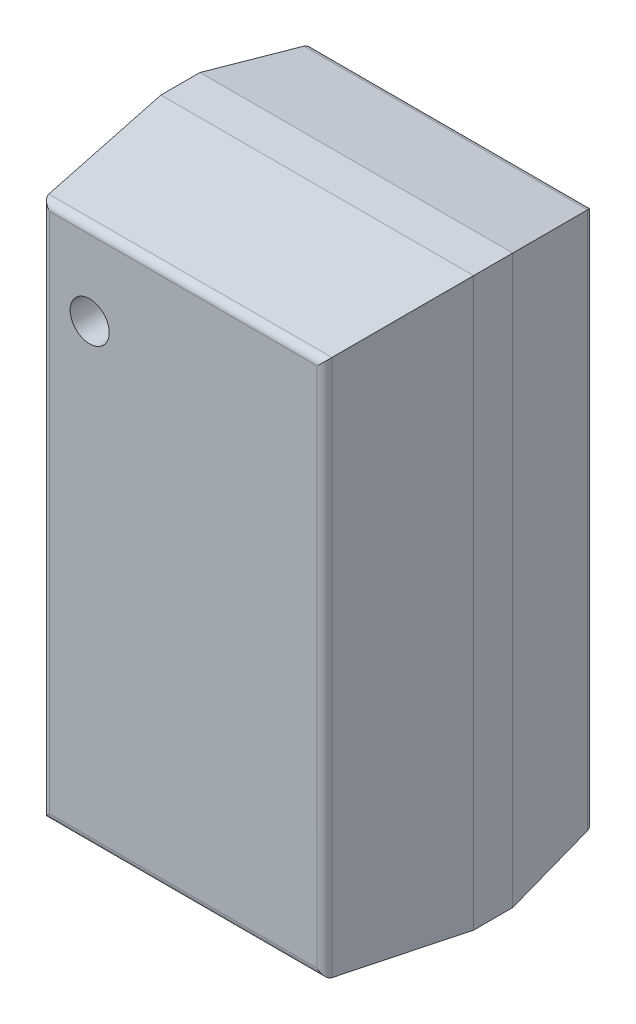
ISO-10303-21;
HEADER;
FILE_DESCRIPTION(('STEP AP214'),'2;1');
FILE_NAME('part.step','',(''),(''),'','','');
FILE_SCHEMA(('AUTOMOTIVE_DESIGN { 1 0 10303 214 1 1 1 1 }'));
ENDSEC;
DATA;
#1=APPLICATION_CONTEXT('core data for automotive mechanical design processes');
#2=APPLICATION_PROTOCOL_DEFINITION('international standard','automotive_design',2000,#1);
#3=PRODUCT_CONTEXT('',#1,'mechanical');
#4=PRODUCT('Part','Part','',(#3));
#5=PRODUCT_RELATED_PRODUCT_CATEGORY('part','',(#4));
#6=PRODUCT_DEFINITION_FORMATION('','',#4);
#7=PRODUCT_DEFINITION_CONTEXT('part definition',#1,'design');
#8=PRODUCT_DEFINITION('design','',#6,#7);
#9=PRODUCT_DEFINITION_SHAPE('','',#8);
#10=(LENGTH_UNIT() NAMED_UNIT(*) SI_UNIT(.MILLI.,.METRE.));
#11=(NAMED_UNIT(*) PLANE_ANGLE_UNIT() SI_UNIT($,.RADIAN.));
#12=(NAMED_UNIT(*) SI_UNIT($,.STERADIAN.) SOLID_ANGLE_UNIT());
#13=UNCERTAINTY_MEASURE_WITH_UNIT(LENGTH_MEASURE(1.E-05),#10,'distance_accuracy_value','');
#14=(GEOMETRIC_REPRESENTATION_CONTEXT(3) GLOBAL_UNCERTAINTY_ASSIGNED_CONTEXT((#13)) GLOBAL_UNIT_ASSIGNED_CONTEXT((#10,
#11,#12)) REPRESENTATION_CONTEXT('',''));
#15=CARTESIAN_POINT('',(0.,0.,0.));
#16=DIRECTION('',(0.,0.,1.));
#17=DIRECTION('',(1.,0.,0.));
#18=AXIS2_PLACEMENT_3D('',#15,#16,#17);
#19=CARTESIAN_POINT('',(-0.48,0.95,1.305));
#20=DIRECTION('',(0.,0.,1.));
#21=DIRECTION('',(1.,0.,0.));
#22=AXIS2_PLACEMENT_3D('',#19,#20,#21);
#23=PLANE('',#22);
#24=CARTESIAN_POINT('',(-0.48,0.95,1.305));
#25=DIRECTION('',(0.,0.,1.));
#26=DIRECTION('',(1.,0.,0.));
#27=AXIS2_PLACEMENT_3D('',#24,#25,#26);
#28=CIRCLE('',#27,0.1);
#29=CARTESIAN_POINT('',(-0.38,0.95,1.305));
#30=VERTEX_POINT('',#29);
#31=EDGE_CURVE('E20',#30,#30,#28,.T.);
#32=ORIENTED_EDGE('',*,*,#31,.T.);
#33=EDGE_LOOP('',(#32));
#34=FACE_BOUND('',#33,.T.);
#35=ADVANCED_FACE('F17',(#34),#23,.T.);
#36=CARTESIAN_POINT('',(-0.48,0.95,1.305));
#37=DIRECTION('',(0.,0.,1.));
#38=DIRECTION('',(1.,0.,0.));
#39=AXIS2_PLACEMENT_3D('',#36,#37,#38);
#40=CYLINDRICAL_SURFACE('',#39,0.1);
#41=CARTESIAN_POINT('',(-0.48,0.95,1.45));
#42=DIRECTION('',(0.,0.,1.));
#43=DIRECTION('',(1.,0.,0.));
#44=AXIS2_PLACEMENT_3D('',#41,#42,#43);
#45=CIRCLE('',#44,0.1);
#46=CARTESIAN_POINT('',(-0.38,0.95,1.45));
#47=VERTEX_POINT('',#46);
#48=EDGE_CURVE('E100',#47,#47,#45,.F.);
#49=ORIENTED_EDGE('',*,*,#48,.F.);
#50=EDGE_LOOP('',(#49));
#51=FACE_BOUND('',#50,.T.);
#52=ORIENTED_EDGE('',*,*,#31,.F.);
#53=EDGE_LOOP('',(#52));
#54=FACE_BOUND('',#53,.T.);
#55=ADVANCED_FACE('F496',(#51,#54),#40,.F.);
#56=CARTESIAN_POINT('',(-0.8,-1.45,1.45));
#57=DIRECTION('',(0.,0.,1.));
#58=DIRECTION('',(1.,0.,0.));
#59=AXIS2_PLACEMENT_3D('',#56,#57,#58);
#60=PLANE('',#59);
#61=ORIENTED_EDGE('',*,*,#48,.T.);
#62=EDGE_LOOP('',(#61));
#63=FACE_BOUND('',#62,.T.);
#64=DIRECTION('',(0.,1.,0.));
#65=VECTOR('',#64,1.);
#66=CARTESIAN_POINT('',(0.684402810399,-1.37,1.45));
#67=LINE('',#66,#65);
#68=CARTESIAN_POINT('',(0.684402810399,1.334402810399,1.45));
#69=VERTEX_POINT('',#68);
#70=CARTESIAN_POINT('',(0.684402810399,-1.334402810399,1.45));
#71=VERTEX_POINT('',#70);
#72=EDGE_CURVE('E107',#69,#71,#67,.F.);
#73=ORIENTED_EDGE('',*,*,#72,.F.);
#74=DIRECTION('',(1.,0.,0.));
#75=VECTOR('',#74,1.);
#76=CARTESIAN_POINT('',(-0.8,1.334402810399,1.45));
#77=LINE('',#76,#75);
#78=CARTESIAN_POINT('',(-0.684402810399,1.334402810399,1.45));
#79=VERTEX_POINT('',#78);
#80=EDGE_CURVE('E96',#69,#79,#77,.F.);
#81=ORIENTED_EDGE('',*,*,#80,.T.);
#82=DIRECTION('',(0.,1.,0.));
#83=VECTOR('',#82,1.);
#84=CARTESIAN_POINT('',(-0.684402810399,-1.37,1.45));
#85=LINE('',#84,#83);
#86=CARTESIAN_POINT('',(-0.684402810399,-1.334402810399,1.45));
#87=VERTEX_POINT('',#86);
#88=EDGE_CURVE('E92',#87,#79,#85,.T.);
#89=ORIENTED_EDGE('',*,*,#88,.F.);
#90=DIRECTION('',(1.,0.,0.));
#91=VECTOR('',#90,1.);
#92=CARTESIAN_POINT('',(-0.72,-1.334402810399,1.45));
#93=LINE('',#92,#91);
#94=EDGE_CURVE('E81',#71,#87,#93,.F.);
#95=ORIENTED_EDGE('',*,*,#94,.F.);
#96=EDGE_LOOP('',(#73,#81,#89,#95));
#97=FACE_BOUND('',#96,.T.);
#98=ADVANCED_FACE('F95',(#63,#97),#60,.T.);
#99=CARTESIAN_POINT('',(-0.684402810399,-1.37,1.41));
#100=DIRECTION('',(0.,1.,0.));
#101=DIRECTION('',(0.,0.,1.));
#102=AXIS2_PLACEMENT_3D('',#99,#100,#101);
#103=CYLINDRICAL_SURFACE('',#102,0.04);
#104=CARTESIAN_POINT('',(-0.684402810399,1.334402810399,1.41));
#105=DIRECTION('',(0.707106781186547,0.707106781186547,0.));
#106=DIRECTION('',(0.707106781186547,-0.707106781186547,0.));
#107=AXIS2_PLACEMENT_3D('',#104,#105,#106);
#108=ELLIPSE('',#107,0.0565685424949238,0.04);
#109=CARTESIAN_POINT('',(-0.724132372194456,1.37413237219469,1.41464348139913));
#110=VERTEX_POINT('',#109);
#111=EDGE_CURVE('E129',#110,#79,#108,.T.);
#112=ORIENTED_EDGE('',*,*,#111,.F.);
#113=DIRECTION('',(0.,1.,0.));
#114=VECTOR('',#113,1.);
#115=CARTESIAN_POINT('',(-0.724132372194474,-1.45,1.41464348139906));
#116=LINE('',#115,#114);
#117=CARTESIAN_POINT('',(-0.724132372194456,-1.37413237219469,1.41464348139913));
#118=VERTEX_POINT('',#117);
#119=EDGE_CURVE('E104',#110,#118,#116,.F.);
#120=ORIENTED_EDGE('',*,*,#119,.T.);
#121=CARTESIAN_POINT('',(-0.684402810399,-1.334402810399,1.41));
#122=DIRECTION('',(0.707106781186547,-0.707106781186547,0.));
#123=DIRECTION('',(0.707106781186547,0.707106781186547,0.));
#124=AXIS2_PLACEMENT_3D('',#121,#122,#123);
#125=ELLIPSE('',#124,0.0565685424949238,0.04);
#126=EDGE_CURVE('E86',#87,#118,#125,.T.);
#127=ORIENTED_EDGE('',*,*,#126,.F.);
#128=ORIENTED_EDGE('',*,*,#88,.T.);
#129=EDGE_LOOP('',(#112,#120,#127,#128));
#130=FACE_BOUND('',#129,.T.);
#131=ADVANCED_FACE('F103',(#130),#103,.T.);
#132=CARTESIAN_POINT('',(-0.72,-1.334402810399,1.41));
#133=DIRECTION('',(1.,0.,0.));
#134=DIRECTION('',(0.,0.,-1.));
#135=AXIS2_PLACEMENT_3D('',#132,#133,#134);
#136=CYLINDRICAL_SURFACE('',#135,0.04);
#137=ORIENTED_EDGE('',*,*,#94,.T.);
#138=ORIENTED_EDGE('',*,*,#126,.T.);
#139=DIRECTION('',(1.,0.,0.));
#140=VECTOR('',#139,1.);
#141=CARTESIAN_POINT('',(-0.8,-1.37413237219447,1.41464348139906));
#142=LINE('',#141,#140);
#143=CARTESIAN_POINT('',(0.724132372194693,-1.37413237219446,1.41464348139913));
#144=VERTEX_POINT('',#143);
#145=EDGE_CURVE('E141',#118,#144,#142,.T.);
#146=ORIENTED_EDGE('',*,*,#145,.T.);
#147=CARTESIAN_POINT('',(0.684402810399,-1.334402810399,1.41));
#148=DIRECTION('',(0.707106781186547,0.707106781186547,0.));
#149=DIRECTION('',(-0.707106781186547,0.707106781186547,0.));
#150=AXIS2_PLACEMENT_3D('',#147,#148,#149);
#151=ELLIPSE('',#150,0.0565685424949238,0.04);
#152=EDGE_CURVE('E88',#71,#144,#151,.T.);
#153=ORIENTED_EDGE('',*,*,#152,.F.);
#154=EDGE_LOOP('',(#137,#138,#146,#153));
#155=FACE_BOUND('',#154,.T.);
#156=ADVANCED_FACE('F83',(#155),#136,.T.);
#157=CARTESIAN_POINT('',(0.684402810399,-1.37,1.41));
#158=DIRECTION('',(0.,1.,0.));
#159=DIRECTION('',(0.,0.,1.));
#160=AXIS2_PLACEMENT_3D('',#157,#158,#159);
#161=CYLINDRICAL_SURFACE('',#160,0.04);
#162=CARTESIAN_POINT('',(0.684402810399,1.334402810399,1.41));
#163=DIRECTION('',(0.707106781186547,-0.707106781186547,0.));
#164=DIRECTION('',(0.707106781186547,0.707106781186547,0.));
#165=AXIS2_PLACEMENT_3D('',#162,#163,#164);
#166=ELLIPSE('',#165,0.0565685424949238,0.04);
#167=CARTESIAN_POINT('',(0.724132372194456,1.37413237219469,1.41464348139913));
#168=VERTEX_POINT('',#167);
#169=EDGE_CURVE('E130',#69,#168,#166,.F.);
#170=ORIENTED_EDGE('',*,*,#169,.F.);
#171=ORIENTED_EDGE('',*,*,#72,.T.);
#172=ORIENTED_EDGE('',*,*,#152,.T.);
#173=DIRECTION('',(0.,1.,0.));
#174=VECTOR('',#173,1.);
#175=CARTESIAN_POINT('',(0.724132372194474,-1.45,1.41464348139906));
#176=LINE('',#175,#174);
#177=EDGE_CURVE('E139',#168,#144,#176,.F.);
#178=ORIENTED_EDGE('',*,*,#177,.F.);
#179=EDGE_LOOP('',(#170,#171,#172,#178));
#180=FACE_BOUND('',#179,.T.);
#181=ADVANCED_FACE('F463',(#180),#161,.T.);
#182=CARTESIAN_POINT('',(-0.72,1.334402810399,1.41));
#183=DIRECTION('',(1.,0.,0.));
#184=DIRECTION('',(0.,0.,-1.));
#185=AXIS2_PLACEMENT_3D('',#182,#183,#184);
#186=CYLINDRICAL_SURFACE('',#185,0.04);
#187=DIRECTION('',(1.,0.,0.));
#188=VECTOR('',#187,1.);
#189=CARTESIAN_POINT('',(-0.8,1.37413237219447,1.41464348139906));
#190=LINE('',#189,#188);
#191=EDGE_CURVE('E149',#110,#168,#190,.T.);
#192=ORIENTED_EDGE('',*,*,#191,.F.);
#193=ORIENTED_EDGE('',*,*,#111,.T.);
#194=ORIENTED_EDGE('',*,*,#80,.F.);
#195=ORIENTED_EDGE('',*,*,#169,.T.);
#196=EDGE_LOOP('',(#192,#193,#194,#195));
#197=FACE_BOUND('',#196,.T.);
#198=ADVANCED_FACE('F453',(#197),#186,.T.);
#199=CARTESIAN_POINT('',(-0.76,-1.45,1.107760560404));
#200=DIRECTION('',(0.993239044897832,0.,-0.11608703497998));
#201=DIRECTION('',(-0.11608703497998,0.,-0.993239044897832));
#202=AXIS2_PLACEMENT_3D('',#199,#200,#201);
#203=PLANE('',#202);
#204=DIRECTION('',(0.115312647071709,-0.115312647071159,0.986613392799205));
#205=VECTOR('',#204,1.);
#206=CARTESIAN_POINT('',(-0.8,1.45000000000011,0.765521120807013));
#207=LINE('',#206,#205);
#208=CARTESIAN_POINT('',(-0.8,1.45000000000003,0.765521120807003));
#209=VERTEX_POINT('',#208);
#210=EDGE_CURVE('E155',#209,#110,#207,.T.);
#211=ORIENTED_EDGE('',*,*,#210,.F.);
#212=DIRECTION('',(0.,1.,0.));
#213=VECTOR('',#212,1.);
#214=CARTESIAN_POINT('',(-0.8,-1.45,0.765521120807));
#215=LINE('',#214,#213);
#216=CARTESIAN_POINT('',(-0.8,-1.45000000000003,0.765521120807003));
#217=VERTEX_POINT('',#216);
#218=EDGE_CURVE('E183',#209,#217,#215,.F.);
#219=ORIENTED_EDGE('',*,*,#218,.T.);
#220=DIRECTION('',(0.115312647071709,0.115312647071159,0.986613392799205));
#221=VECTOR('',#220,1.);
#222=CARTESIAN_POINT('',(-0.8,-1.45000000000011,0.765521120807013));
#223=LINE('',#222,#221);
#224=EDGE_CURVE('E142',#217,#118,#223,.T.);
#225=ORIENTED_EDGE('',*,*,#224,.T.);
#226=ORIENTED_EDGE('',*,*,#119,.F.);
#227=EDGE_LOOP('',(#211,#219,#225,#226));
#228=FACE_BOUND('',#227,.T.);
#229=ADVANCED_FACE('F444',(#228),#203,.F.);
#230=CARTESIAN_POINT('',(-0.8,-1.41,1.107760560404));
#231=DIRECTION('',(0.,0.993239044897832,-0.11608703497998));
#232=DIRECTION('',(0.,0.11608703497998,0.993239044897832));
#233=AXIS2_PLACEMENT_3D('',#230,#231,#232);
#234=PLANE('',#233);
#235=DIRECTION('',(1.,0.,0.));
#236=VECTOR('',#235,1.);
#237=CARTESIAN_POINT('',(-0.8,-1.45,0.765521120807));
#238=LINE('',#237,#236);
#239=CARTESIAN_POINT('',(0.800000000000028,-1.45,0.765521120807003));
#240=VERTEX_POINT('',#239);
#241=EDGE_CURVE('E170',#217,#240,#238,.T.);
#242=ORIENTED_EDGE('',*,*,#241,.T.);
#243=DIRECTION('',(0.115312647071159,-0.115312647071709,-0.986613392799205));
#244=VECTOR('',#243,1.);
#245=CARTESIAN_POINT('',(0.724132372194474,-1.374132372194,1.41464348139906));
#246=LINE('',#245,#244);
#247=EDGE_CURVE('E144',#144,#240,#246,.T.);
#248=ORIENTED_EDGE('',*,*,#247,.F.);
#249=ORIENTED_EDGE('',*,*,#145,.F.);
#250=ORIENTED_EDGE('',*,*,#224,.F.);
#251=EDGE_LOOP('',(#242,#248,#249,#250));
#252=FACE_BOUND('',#251,.T.);
#253=ADVANCED_FACE('F435',(#252),#234,.F.);
#254=CARTESIAN_POINT('',(0.76,-1.45,1.107760560404));
#255=DIRECTION('',(0.993239044897832,0.,0.11608703497998));
#256=DIRECTION('',(0.11608703497998,0.,-0.993239044897832));
#257=AXIS2_PLACEMENT_3D('',#254,#255,#256);
#258=PLANE('',#257);
#259=DIRECTION('',(0.115312647071709,0.115312647071159,-0.986613392799205));
#260=VECTOR('',#259,1.);
#261=CARTESIAN_POINT('',(0.724132372194,1.37413237219447,1.41464348139906));
#262=LINE('',#261,#260);
#263=CARTESIAN_POINT('',(0.8,1.45000000000003,0.765521120807003));
#264=VERTEX_POINT('',#263);
#265=EDGE_CURVE('E150',#168,#264,#262,.T.);
#266=ORIENTED_EDGE('',*,*,#265,.F.);
#267=ORIENTED_EDGE('',*,*,#177,.T.);
#268=ORIENTED_EDGE('',*,*,#247,.T.);
#269=DIRECTION('',(0.,1.,0.));
#270=VECTOR('',#269,1.);
#271=CARTESIAN_POINT('',(0.8,-1.45,0.765521120807));
#272=LINE('',#271,#270);
#273=EDGE_CURVE('E180',#264,#240,#272,.F.);
#274=ORIENTED_EDGE('',*,*,#273,.F.);
#275=EDGE_LOOP('',(#266,#267,#268,#274));
#276=FACE_BOUND('',#275,.T.);
#277=ADVANCED_FACE('F426',(#276),#258,.T.);
#278=CARTESIAN_POINT('',(-0.8,1.41,1.107760560404));
#279=DIRECTION('',(0.,0.993239044897832,0.11608703497998));
#280=DIRECTION('',(0.,-0.11608703497998,0.993239044897832));
#281=AXIS2_PLACEMENT_3D('',#278,#279,#280);
#282=PLANE('',#281);
#283=DIRECTION('',(1.,0.,0.));
#284=VECTOR('',#283,1.);
#285=CARTESIAN_POINT('',(-0.8,1.45,0.765521120807));
#286=LINE('',#285,#284);
#287=EDGE_CURVE('E202',#209,#264,#286,.T.);
#288=ORIENTED_EDGE('',*,*,#287,.F.);
#289=ORIENTED_EDGE('',*,*,#210,.T.);
#290=ORIENTED_EDGE('',*,*,#191,.T.);
#291=ORIENTED_EDGE('',*,*,#265,.T.);
#292=EDGE_LOOP('',(#288,#289,#290,#291));
#293=FACE_BOUND('',#292,.T.);
#294=ADVANCED_FACE('F417',(#293),#282,.T.);
#295=CARTESIAN_POINT('',(-0.8,-1.45,0.075));
#296=DIRECTION('',(1.,0.,0.));
#297=DIRECTION('',(0.,0.,-1.));
#298=AXIS2_PLACEMENT_3D('',#295,#296,#297);
#299=PLANE('',#298);
#300=DIRECTION('',(0.,0.,1.));
#301=VECTOR('',#300,1.);
#302=CARTESIAN_POINT('',(-0.8,1.45,0.075));
#303=LINE('',#302,#301);
#304=CARTESIAN_POINT('',(-0.799999999999954,1.44999999999986,0.565521120807023));
#305=VERTEX_POINT('',#304);
#306=EDGE_CURVE('E206',#305,#209,#303,.T.);
#307=ORIENTED_EDGE('',*,*,#306,.F.);
#308=DIRECTION('',(0.,1.,0.));
#309=VECTOR('',#308,1.);
#310=CARTESIAN_POINT('',(-0.799999999999816,-1.45,0.56552112080703));
#311=LINE('',#310,#309);
#312=CARTESIAN_POINT('',(-0.799999999999954,-1.44999999999991,0.565521120807023));
#313=VERTEX_POINT('',#312);
#314=EDGE_CURVE('E205',#313,#305,#311,.T.);
#315=ORIENTED_EDGE('',*,*,#314,.F.);
#316=DIRECTION('',(0.,0.,1.));
#317=VECTOR('',#316,1.);
#318=CARTESIAN_POINT('',(-0.8,-1.45,0.075));
#319=LINE('',#318,#317);
#320=EDGE_CURVE('E173',#313,#217,#319,.T.);
#321=ORIENTED_EDGE('',*,*,#320,.T.);
#322=ORIENTED_EDGE('',*,*,#218,.F.);
#323=EDGE_LOOP('',(#307,#315,#321,#322));
#324=FACE_BOUND('',#323,.T.);
#325=ADVANCED_FACE('F407',(#324),#299,.F.);
#326=CARTESIAN_POINT('',(-0.8,-1.45,0.075));
#327=DIRECTION('',(0.,1.,0.));
#328=DIRECTION('',(0.,0.,1.));
#329=AXIS2_PLACEMENT_3D('',#326,#327,#328);
#330=PLANE('',#329);
#331=ORIENTED_EDGE('',*,*,#320,.F.);
#332=DIRECTION('',(1.,0.,0.));
#333=VECTOR('',#332,1.);
#334=CARTESIAN_POINT('',(-0.8,-1.44999999999982,0.56552112080703));
#335=LINE('',#334,#333);
#336=CARTESIAN_POINT('',(0.799999999999908,-1.44999999999995,0.56552112080703));
#337=VERTEX_POINT('',#336);
#338=EDGE_CURVE('E235',#337,#313,#335,.F.);
#339=ORIENTED_EDGE('',*,*,#338,.F.);
#340=DIRECTION('',(0.,0.,-1.));
#341=VECTOR('',#340,1.);
#342=CARTESIAN_POINT('',(0.8,-1.45,0.075));
#343=LINE('',#342,#341);
#344=EDGE_CURVE('E172',#240,#337,#343,.T.);
#345=ORIENTED_EDGE('',*,*,#344,.F.);
#346=ORIENTED_EDGE('',*,*,#241,.F.);
#347=EDGE_LOOP('',(#331,#339,#345,#346));
#348=FACE_BOUND('',#347,.T.);
#349=ADVANCED_FACE('F398',(#348),#330,.F.);
#350=CARTESIAN_POINT('',(0.8,-1.45,0.075));
#351=DIRECTION('',(1.,0.,0.));
#352=DIRECTION('',(0.,0.,-1.));
#353=AXIS2_PLACEMENT_3D('',#350,#351,#352);
#354=PLANE('',#353);
#355=DIRECTION('',(0.,0.,1.));
#356=VECTOR('',#355,1.);
#357=CARTESIAN_POINT('',(0.8,1.45,0.075));
#358=LINE('',#357,#356);
#359=CARTESIAN_POINT('',(0.799999999999954,1.44999999999991,0.56552112080703));
#360=VERTEX_POINT('',#359);
#361=EDGE_CURVE('E210',#264,#360,#358,.F.);
#362=ORIENTED_EDGE('',*,*,#361,.F.);
#363=ORIENTED_EDGE('',*,*,#273,.T.);
#364=ORIENTED_EDGE('',*,*,#344,.T.);
#365=DIRECTION('',(0.,1.,0.));
#366=VECTOR('',#365,1.);
#367=CARTESIAN_POINT('',(0.799999999999816,-1.45,0.56552112080703));
#368=LINE('',#367,#366);
#369=EDGE_CURVE('E228',#337,#360,#368,.T.);
#370=ORIENTED_EDGE('',*,*,#369,.T.);
#371=EDGE_LOOP('',(#362,#363,#364,#370));
#372=FACE_BOUND('',#371,.T.);
#373=ADVANCED_FACE('F389',(#372),#354,.T.);
#374=CARTESIAN_POINT('',(-0.8,1.45,0.075));
#375=DIRECTION('',(0.,1.,0.));
#376=DIRECTION('',(0.,0.,1.));
#377=AXIS2_PLACEMENT_3D('',#374,#375,#376);
#378=PLANE('',#377);
#379=ORIENTED_EDGE('',*,*,#306,.T.);
#380=ORIENTED_EDGE('',*,*,#287,.T.);
#381=ORIENTED_EDGE('',*,*,#361,.T.);
#382=DIRECTION('',(1.,0.,0.));
#383=VECTOR('',#382,1.);
#384=CARTESIAN_POINT('',(-0.8,1.44999999999982,0.56552112080703));
#385=LINE('',#384,#383);
#386=EDGE_CURVE('E254',#360,#305,#385,.F.);
#387=ORIENTED_EDGE('',*,*,#386,.T.);
#388=EDGE_LOOP('',(#379,#380,#381,#387));
#389=FACE_BOUND('',#388,.T.);
#390=ADVANCED_FACE('F380',(#389),#378,.T.);
#391=CARTESIAN_POINT('',(-0.76,-1.45,0.320260560404));
#392=DIRECTION('',(-0.986960090151339,0.,-0.160965152901055));
#393=DIRECTION('',(-0.160965152901055,0.,0.986960090151339));
#394=AXIS2_PLACEMENT_3D('',#391,#392,#393);
#395=PLANE('',#394);
#396=DIRECTION('',(0.158919533443532,-0.158919533444125,-0.974417345791829));
#397=VECTOR('',#396,1.);
#398=CARTESIAN_POINT('',(-0.8,1.44999999999982,0.56552112080703));
#399=LINE('',#398,#397);
#400=CARTESIAN_POINT('',(-0.725473590018528,1.37547359001818,0.108561393884041));
#401=VERTEX_POINT('',#400);
#402=EDGE_CURVE('E256',#305,#401,#399,.T.);
#403=ORIENTED_EDGE('',*,*,#402,.T.);
#404=DIRECTION('',(0.,1.,0.));
#405=VECTOR('',#404,1.);
#406=CARTESIAN_POINT('',(-0.725473590018085,-1.37,0.108561393884149));
#407=LINE('',#406,#405);
#408=CARTESIAN_POINT('',(-0.725473590018528,-1.37547359001818,0.108561393884041));
#409=VERTEX_POINT('',#408);
#410=EDGE_CURVE('E128',#409,#401,#407,.T.);
#411=ORIENTED_EDGE('',*,*,#410,.F.);
#412=DIRECTION('',(0.158919533443532,0.158919533444125,-0.974417345791829));
#413=VECTOR('',#412,1.);
#414=CARTESIAN_POINT('',(-0.8,-1.44999999999982,0.56552112080703));
#415=LINE('',#414,#413);
#416=EDGE_CURVE('E237',#313,#409,#415,.T.);
#417=ORIENTED_EDGE('',*,*,#416,.F.);
#418=ORIENTED_EDGE('',*,*,#314,.T.);
#419=EDGE_LOOP('',(#403,#411,#417,#418));
#420=FACE_BOUND('',#419,.T.);
#421=ADVANCED_FACE('F301',(#420),#395,.T.);
#422=CARTESIAN_POINT('',(-0.8,-1.41,0.320260560404));
#423=DIRECTION('',(0.,-0.986960090151339,-0.160965152901055));
#424=DIRECTION('',(0.,0.160965152901055,-0.986960090151339));
#425=AXIS2_PLACEMENT_3D('',#422,#423,#424);
#426=PLANE('',#425);
#427=ORIENTED_EDGE('',*,*,#338,.T.);
#428=ORIENTED_EDGE('',*,*,#416,.T.);
#429=DIRECTION('',(1.,0.,0.));
#430=VECTOR('',#429,1.);
#431=CARTESIAN_POINT('',(-0.72,-1.37547359001809,0.108561393884149));
#432=LINE('',#431,#430);
#433=CARTESIAN_POINT('',(0.725473590018184,-1.37547359001853,0.108561393884041));
#434=VERTEX_POINT('',#433);
#435=EDGE_CURVE('E127',#434,#409,#432,.F.);
#436=ORIENTED_EDGE('',*,*,#435,.F.);
#437=DIRECTION('',(0.158919533444125,-0.158919533443531,0.974417345791828));
#438=VECTOR('',#437,1.);
#439=CARTESIAN_POINT('',(0.725473590018538,-1.375473590019,0.108561393884075));
#440=LINE('',#439,#438);
#441=EDGE_CURVE('E231',#434,#337,#440,.T.);
#442=ORIENTED_EDGE('',*,*,#441,.T.);
#443=EDGE_LOOP('',(#427,#428,#436,#442));
#444=FACE_BOUND('',#443,.T.);
#445=ADVANCED_FACE('F275',(#444),#426,.T.);
#446=CARTESIAN_POINT('',(0.76,-1.45,0.320260560404));
#447=DIRECTION('',(-0.986960090151339,0.,0.160965152901055));
#448=DIRECTION('',(0.160965152901055,0.,0.986960090151339));
#449=AXIS2_PLACEMENT_3D('',#446,#447,#448);
#450=PLANE('',#449);
#451=DIRECTION('',(0.158919533443532,0.158919533444125,0.974417345791829));
#452=VECTOR('',#451,1.);
#453=CARTESIAN_POINT('',(0.725473590019,1.37547359001854,0.108561393884075));
#454=LINE('',#453,#452);
#455=CARTESIAN_POINT('',(0.725473590018528,1.37547359001818,0.108561393884041));
#456=VERTEX_POINT('',#455);
#457=EDGE_CURVE('E230',#456,#360,#454,.T.);
#458=ORIENTED_EDGE('',*,*,#457,.T.);
#459=ORIENTED_EDGE('',*,*,#369,.F.);
#460=ORIENTED_EDGE('',*,*,#441,.F.);
#461=DIRECTION('',(0.,1.,0.));
#462=VECTOR('',#461,1.);
#463=CARTESIAN_POINT('',(0.725473590018085,-1.37,0.108561393884149));
#464=LINE('',#463,#462);
#465=EDGE_CURVE('E124',#456,#434,#464,.F.);
#466=ORIENTED_EDGE('',*,*,#465,.F.);
#467=EDGE_LOOP('',(#458,#459,#460,#466));
#468=FACE_BOUND('',#467,.T.);
#469=ADVANCED_FACE('F280',(#468),#450,.F.);
#470=CARTESIAN_POINT('',(-0.8,1.41,0.320260560404));
#471=DIRECTION('',(0.,-0.986960090151339,0.160965152901055));
#472=DIRECTION('',(0.,-0.160965152901055,-0.986960090151339));
#473=AXIS2_PLACEMENT_3D('',#470,#471,#472);
#474=PLANE('',#473);
#475=ORIENTED_EDGE('',*,*,#386,.F.);
#476=ORIENTED_EDGE('',*,*,#457,.F.);
#477=DIRECTION('',(1.,0.,0.));
#478=VECTOR('',#477,1.);
#479=CARTESIAN_POINT('',(-0.72,1.37547359001809,0.108561393884149));
#480=LINE('',#479,#478);
#481=EDGE_CURVE('E118',#401,#456,#480,.T.);
#482=ORIENTED_EDGE('',*,*,#481,.F.);
#483=ORIENTED_EDGE('',*,*,#402,.F.);
#484=EDGE_LOOP('',(#475,#476,#482,#483));
#485=FACE_BOUND('',#484,.T.);
#486=ADVANCED_FACE('F303',(#485),#474,.F.);
#487=CARTESIAN_POINT('',(-0.685995186412,-1.37,0.115));
#488=DIRECTION('',(0.,1.,0.));
#489=DIRECTION('',(0.,0.,1.));
#490=AXIS2_PLACEMENT_3D('',#487,#488,#489);
#491=CYLINDRICAL_SURFACE('',#490,0.04);
#492=DIRECTION('',(0.,1.,0.));
#493=VECTOR('',#492,1.);
#494=CARTESIAN_POINT('',(-0.685995186412,-1.45,0.075));
#495=LINE('',#494,#493);
#496=CARTESIAN_POINT('',(-0.685995186412,1.335995186412,0.075));
#497=VERTEX_POINT('',#496);
#498=CARTESIAN_POINT('',(-0.685995186412,-1.335995186412,0.075));
#499=VERTEX_POINT('',#498);
#500=EDGE_CURVE('E117',#497,#499,#495,.F.);
#501=ORIENTED_EDGE('',*,*,#500,.T.);
#502=CARTESIAN_POINT('',(-0.685995186412,-1.335995186412,0.115));
#503=DIRECTION('',(0.707106781186547,-0.707106781186547,0.));
#504=DIRECTION('',(0.707106781186547,0.707106781186547,0.));
#505=AXIS2_PLACEMENT_3D('',#502,#503,#504);
#506=ELLIPSE('',#505,0.0565685424949238,0.04);
#507=EDGE_CURVE('E125',#409,#499,#506,.T.);
#508=ORIENTED_EDGE('',*,*,#507,.F.);
#509=ORIENTED_EDGE('',*,*,#410,.T.);
#510=CARTESIAN_POINT('',(-0.685995186412,1.335995186412,0.115));
#511=DIRECTION('',(0.707106781186547,0.707106781186547,0.));
#512=DIRECTION('',(0.707106781186547,-0.707106781186547,0.));
#513=AXIS2_PLACEMENT_3D('',#510,#511,#512);
#514=ELLIPSE('',#513,0.0565685424949238,0.04);
#515=EDGE_CURVE('E119',#497,#401,#514,.T.);
#516=ORIENTED_EDGE('',*,*,#515,.F.);
#517=EDGE_LOOP('',(#501,#508,#509,#516));
#518=FACE_BOUND('',#517,.T.);
#519=ADVANCED_FACE('F297',(#518),#491,.T.);
#520=CARTESIAN_POINT('',(-0.72,-1.335995186412,0.115));
#521=DIRECTION('',(1.,0.,0.));
#522=DIRECTION('',(0.,0.,-1.));
#523=AXIS2_PLACEMENT_3D('',#520,#521,#522);
#524=CYLINDRICAL_SURFACE('',#523,0.04);
#525=CARTESIAN_POINT('',(0.685995186412,-1.335995186412,0.115));
#526=DIRECTION('',(0.707106781186547,0.707106781186547,0.));
#527=DIRECTION('',(-0.707106781186547,0.707106781186547,0.));
#528=AXIS2_PLACEMENT_3D('',#525,#526,#527);
#529=ELLIPSE('',#528,0.0565685424949238,0.04);
#530=CARTESIAN_POINT('',(0.685995186412,-1.335995186412,0.075));
#531=VERTEX_POINT('',#530);
#532=EDGE_CURVE('E122',#434,#531,#529,.T.);
#533=ORIENTED_EDGE('',*,*,#532,.F.);
#534=ORIENTED_EDGE('',*,*,#435,.T.);
#535=ORIENTED_EDGE('',*,*,#507,.T.);
#536=DIRECTION('',(1.,0.,0.));
#537=VECTOR('',#536,1.);
#538=CARTESIAN_POINT('',(-0.8,-1.335995186412,0.075));
#539=LINE('',#538,#537);
#540=EDGE_CURVE('E289',#499,#531,#539,.T.);
#541=ORIENTED_EDGE('',*,*,#540,.T.);
#542=EDGE_LOOP('',(#533,#534,#535,#541));
#543=FACE_BOUND('',#542,.T.);
#544=ADVANCED_FACE('F310',(#543),#524,.T.);
#545=CARTESIAN_POINT('',(0.685995186412,-1.37,0.115));
#546=DIRECTION('',(0.,1.,0.));
#547=DIRECTION('',(0.,0.,1.));
#548=AXIS2_PLACEMENT_3D('',#545,#546,#547);
#549=CYLINDRICAL_SURFACE('',#548,0.04);
#550=ORIENTED_EDGE('',*,*,#465,.T.);
#551=ORIENTED_EDGE('',*,*,#532,.T.);
#552=DIRECTION('',(0.,1.,0.));
#553=VECTOR('',#552,1.);
#554=CARTESIAN_POINT('',(0.685995186412,-1.45,0.075));
#555=LINE('',#554,#553);
#556=CARTESIAN_POINT('',(0.685995186412,1.335995186412,0.075));
#557=VERTEX_POINT('',#556);
#558=EDGE_CURVE('E26',#531,#557,#555,.T.);
#559=ORIENTED_EDGE('',*,*,#558,.T.);
#560=CARTESIAN_POINT('',(0.685995186412,1.335995186412,0.115));
#561=DIRECTION('',(0.707106781186547,-0.707106781186547,0.));
#562=DIRECTION('',(0.707106781186547,0.707106781186547,0.));
#563=AXIS2_PLACEMENT_3D('',#560,#561,#562);
#564=ELLIPSE('',#563,0.0565685424949238,0.04);
#565=EDGE_CURVE('E34',#456,#557,#564,.F.);
#566=ORIENTED_EDGE('',*,*,#565,.F.);
#567=EDGE_LOOP('',(#550,#551,#559,#566));
#568=FACE_BOUND('',#567,.T.);
#569=ADVANCED_FACE('F282',(#568),#549,.T.);
#570=CARTESIAN_POINT('',(-0.72,1.335995186412,0.115));
#571=DIRECTION('',(1.,0.,0.));
#572=DIRECTION('',(0.,0.,-1.));
#573=AXIS2_PLACEMENT_3D('',#570,#571,#572);
#574=CYLINDRICAL_SURFACE('',#573,0.04);
#575=ORIENTED_EDGE('',*,*,#565,.T.);
#576=DIRECTION('',(1.,0.,0.));
#577=VECTOR('',#576,1.);
#578=CARTESIAN_POINT('',(-0.8,1.335995186412,0.075));
#579=LINE('',#578,#577);
#580=EDGE_CURVE('E11',#557,#497,#579,.F.);
#581=ORIENTED_EDGE('',*,*,#580,.T.);
#582=ORIENTED_EDGE('',*,*,#515,.T.);
#583=ORIENTED_EDGE('',*,*,#481,.T.);
#584=EDGE_LOOP('',(#575,#581,#582,#583));
#585=FACE_BOUND('',#584,.T.);
#586=ADVANCED_FACE('F298',(#585),#574,.T.);
#587=CARTESIAN_POINT('',(-0.8,-1.45,0.075));
#588=DIRECTION('',(0.,0.,1.));
#589=DIRECTION('',(1.,0.,0.));
#590=AXIS2_PLACEMENT_3D('',#587,#588,#589);
#591=PLANE('',#590);
#592=ORIENTED_EDGE('',*,*,#558,.F.);
#593=ORIENTED_EDGE('',*,*,#540,.F.);
#594=ORIENTED_EDGE('',*,*,#500,.F.);
#595=ORIENTED_EDGE('',*,*,#580,.F.);
#596=EDGE_LOOP('',(#592,#593,#594,#595));
#597=FACE_BOUND('',#596,.T.);
#598=ADVANCED_FACE('F308',(#597),#591,.F.);
#599=CLOSED_SHELL('',(#35,#55,#98,#131,#156,#181,#198,#229,#253,#277,#294,#325,#349,#373,#390,
#421,#445,#469,#486,#519,#544,#569,#586,#598));
#600=MANIFOLD_SOLID_BREP('B1',#599);
#601=ADVANCED_BREP_SHAPE_REPRESENTATION('',(#18,#600),#14);
#602=SHAPE_DEFINITION_REPRESENTATION(#9,#601);
ENDSEC;
END-ISO-10303-21;
